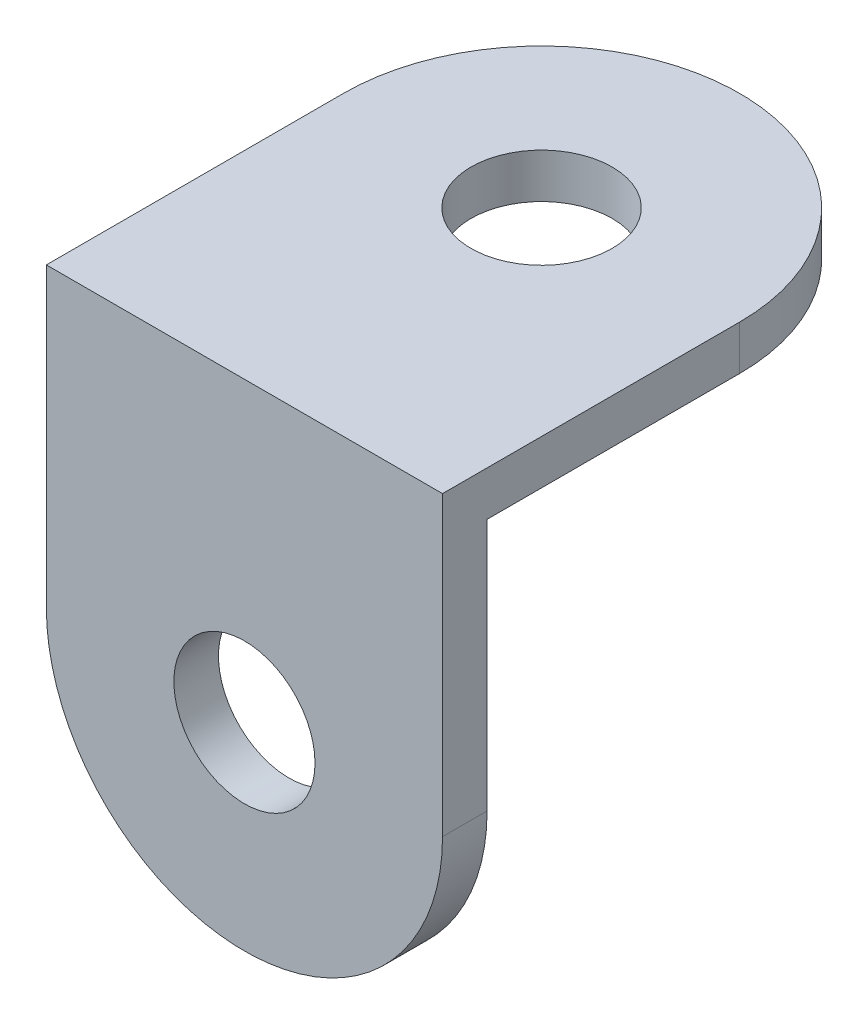
ISO-10303-21;
HEADER;
FILE_DESCRIPTION(('STEP AP214'),'2;1');
FILE_NAME('part.step','',(''),(''),'','','');
FILE_SCHEMA(('AUTOMOTIVE_DESIGN { 1 0 10303 214 1 1 1 1 }'));
ENDSEC;
DATA;
#1=APPLICATION_CONTEXT('core data for automotive mechanical design processes');
#2=APPLICATION_PROTOCOL_DEFINITION('international standard','automotive_design',2000,#1);
#3=PRODUCT_CONTEXT('',#1,'mechanical');
#4=PRODUCT('Part','Part','',(#3));
#5=PRODUCT_RELATED_PRODUCT_CATEGORY('part','',(#4));
#6=PRODUCT_DEFINITION_FORMATION('','',#4);
#7=PRODUCT_DEFINITION_CONTEXT('part definition',#1,'design');
#8=PRODUCT_DEFINITION('design','',#6,#7);
#9=PRODUCT_DEFINITION_SHAPE('','',#8);
#10=(LENGTH_UNIT() NAMED_UNIT(*) SI_UNIT(.MILLI.,.METRE.));
#11=(NAMED_UNIT(*) PLANE_ANGLE_UNIT() SI_UNIT($,.RADIAN.));
#12=(NAMED_UNIT(*) SI_UNIT($,.STERADIAN.) SOLID_ANGLE_UNIT());
#13=UNCERTAINTY_MEASURE_WITH_UNIT(LENGTH_MEASURE(1.E-05),#10,'distance_accuracy_value','');
#14=(GEOMETRIC_REPRESENTATION_CONTEXT(3) GLOBAL_UNCERTAINTY_ASSIGNED_CONTEXT((#13)) GLOBAL_UNIT_ASSIGNED_CONTEXT((#10,
#11,#12)) REPRESENTATION_CONTEXT('',''));
#15=CARTESIAN_POINT('',(0.,0.,0.));
#16=DIRECTION('',(0.,0.,1.));
#17=DIRECTION('',(1.,0.,0.));
#18=AXIS2_PLACEMENT_3D('',#15,#16,#17);
#19=CARTESIAN_POINT('',(0.,1.8,0.));
#20=DIRECTION('',(0.,1.,0.));
#21=DIRECTION('',(1.,0.,0.));
#22=AXIS2_PLACEMENT_3D('',#19,#20,#21);
#23=PLANE('',#22);
#24=CARTESIAN_POINT('',(0.,1.8,-12.));
#25=DIRECTION('',(0.,1.,0.));
#26=DIRECTION('',(1.,0.,0.));
#27=AXIS2_PLACEMENT_3D('',#24,#25,#26);
#28=CIRCLE('',#27,8.);
#29=CARTESIAN_POINT('',(8.,1.8,-12.));
#30=VERTEX_POINT('',#29);
#31=CARTESIAN_POINT('',(-8.,1.8,-12.));
#32=VERTEX_POINT('',#31);
#33=EDGE_CURVE('E11',#30,#32,#28,.T.);
#34=ORIENTED_EDGE('',*,*,#33,.T.);
#35=DIRECTION('',(0.,0.,1.));
#36=VECTOR('',#35,1.);
#37=CARTESIAN_POINT('',(-8.,1.8,-12.));
#38=LINE('',#37,#36);
#39=CARTESIAN_POINT('',(-8.,1.8,0.));
#40=VERTEX_POINT('',#39);
#41=EDGE_CURVE('E57',#32,#40,#38,.T.);
#42=ORIENTED_EDGE('',*,*,#41,.T.);
#43=DIRECTION('',(1.,0.,0.));
#44=VECTOR('',#43,1.);
#45=CARTESIAN_POINT('',(-8.,1.8,0.));
#46=LINE('',#45,#44);
#47=CARTESIAN_POINT('',(8.,1.8,0.));
#48=VERTEX_POINT('',#47);
#49=EDGE_CURVE('E106',#40,#48,#46,.T.);
#50=ORIENTED_EDGE('',*,*,#49,.T.);
#51=DIRECTION('',(0.,0.,-1.));
#52=VECTOR('',#51,1.);
#53=CARTESIAN_POINT('',(8.,1.8,0.));
#54=LINE('',#53,#52);
#55=EDGE_CURVE('E50',#48,#30,#54,.T.);
#56=ORIENTED_EDGE('',*,*,#55,.T.);
#57=EDGE_LOOP('',(#34,#42,#50,#56));
#58=FACE_BOUND('',#57,.T.);
#59=CARTESIAN_POINT('',(0.,1.8,-12.));
#60=DIRECTION('',(0.,-1.,0.));
#61=DIRECTION('',(0.,0.,-1.));
#62=AXIS2_PLACEMENT_3D('',#59,#60,#61);
#63=CIRCLE('',#62,2.84999999999999);
#64=CARTESIAN_POINT('',(0.,1.8,-14.85));
#65=VERTEX_POINT('',#64);
#66=EDGE_CURVE('E120',#65,#65,#63,.T.);
#67=ORIENTED_EDGE('',*,*,#66,.T.);
#68=EDGE_LOOP('',(#67));
#69=FACE_BOUND('',#68,.T.);
#70=ADVANCED_FACE('F46',(#58,#69),#23,.T.);
#71=CARTESIAN_POINT('',(0.,0.,0.));
#72=DIRECTION('',(0.,1.,0.));
#73=DIRECTION('',(1.,0.,0.));
#74=AXIS2_PLACEMENT_3D('',#71,#72,#73);
#75=PLANE('',#74);
#76=CARTESIAN_POINT('',(0.,0.,-12.));
#77=DIRECTION('',(0.,-1.,0.));
#78=DIRECTION('',(0.,0.,-1.));
#79=AXIS2_PLACEMENT_3D('',#76,#77,#78);
#80=CIRCLE('',#79,2.84999999999999);
#81=CARTESIAN_POINT('',(0.,0.,-14.85));
#82=VERTEX_POINT('',#81);
#83=EDGE_CURVE('E168',#82,#82,#80,.T.);
#84=ORIENTED_EDGE('',*,*,#83,.F.);
#85=EDGE_LOOP('',(#84));
#86=FACE_BOUND('',#85,.T.);
#87=DIRECTION('',(0.,0.,1.));
#88=VECTOR('',#87,1.);
#89=CARTESIAN_POINT('',(-8.,0.,-12.));
#90=LINE('',#89,#88);
#91=CARTESIAN_POINT('',(-8.,0.,-12.));
#92=VERTEX_POINT('',#91);
#93=CARTESIAN_POINT('',(-8.,0.,-1.8));
#94=VERTEX_POINT('',#93);
#95=EDGE_CURVE('E118',#92,#94,#90,.T.);
#96=ORIENTED_EDGE('',*,*,#95,.F.);
#97=CARTESIAN_POINT('',(0.,0.,-12.));
#98=DIRECTION('',(0.,1.,0.));
#99=DIRECTION('',(1.,0.,0.));
#100=AXIS2_PLACEMENT_3D('',#97,#98,#99);
#101=CIRCLE('',#100,8.);
#102=CARTESIAN_POINT('',(8.,0.,-12.));
#103=VERTEX_POINT('',#102);
#104=EDGE_CURVE('E65',#103,#92,#101,.T.);
#105=ORIENTED_EDGE('',*,*,#104,.F.);
#106=DIRECTION('',(0.,0.,-1.));
#107=VECTOR('',#106,1.);
#108=CARTESIAN_POINT('',(8.,0.,-1.8));
#109=LINE('',#108,#107);
#110=CARTESIAN_POINT('',(8.,0.,-1.8));
#111=VERTEX_POINT('',#110);
#112=EDGE_CURVE('E123',#111,#103,#109,.T.);
#113=ORIENTED_EDGE('',*,*,#112,.F.);
#114=DIRECTION('',(1.,0.,0.));
#115=VECTOR('',#114,1.);
#116=CARTESIAN_POINT('',(-8.,0.,-1.8));
#117=LINE('',#116,#115);
#118=EDGE_CURVE('E160',#94,#111,#117,.T.);
#119=ORIENTED_EDGE('',*,*,#118,.F.);
#120=EDGE_LOOP('',(#96,#105,#113,#119));
#121=FACE_BOUND('',#120,.T.);
#122=ADVANCED_FACE('F194',(#86,#121),#75,.F.);
#123=CARTESIAN_POINT('',(8.,0.,0.));
#124=DIRECTION('',(1.,0.,0.));
#125=DIRECTION('',(0.,1.,0.));
#126=AXIS2_PLACEMENT_3D('',#123,#124,#125);
#127=PLANE('',#126);
#128=DIRECTION('',(0.,1.,0.));
#129=VECTOR('',#128,1.);
#130=CARTESIAN_POINT('',(8.,0.,-12.));
#131=LINE('',#130,#129);
#132=EDGE_CURVE('E144',#103,#30,#131,.T.);
#133=ORIENTED_EDGE('',*,*,#132,.T.);
#134=ORIENTED_EDGE('',*,*,#55,.F.);
#135=DIRECTION('',(0.,1.,0.));
#136=VECTOR('',#135,1.);
#137=CARTESIAN_POINT('',(8.,-10.2,0.));
#138=LINE('',#137,#136);
#139=CARTESIAN_POINT('',(8.,-10.2,0.));
#140=VERTEX_POINT('',#139);
#141=EDGE_CURVE('E128',#140,#48,#138,.T.);
#142=ORIENTED_EDGE('',*,*,#141,.F.);
#143=DIRECTION('',(0.,0.,-1.));
#144=VECTOR('',#143,1.);
#145=CARTESIAN_POINT('',(8.,-10.2,0.));
#146=LINE('',#145,#144);
#147=CARTESIAN_POINT('',(8.,-10.2,-1.8));
#148=VERTEX_POINT('',#147);
#149=EDGE_CURVE('E147',#140,#148,#146,.T.);
#150=ORIENTED_EDGE('',*,*,#149,.T.);
#151=DIRECTION('',(0.,1.,0.));
#152=VECTOR('',#151,1.);
#153=CARTESIAN_POINT('',(8.,-10.2,-1.8));
#154=LINE('',#153,#152);
#155=EDGE_CURVE('E150',#148,#111,#154,.T.);
#156=ORIENTED_EDGE('',*,*,#155,.T.);
#157=ORIENTED_EDGE('',*,*,#112,.T.);
#158=EDGE_LOOP('',(#133,#134,#142,#150,#156,#157));
#159=FACE_BOUND('',#158,.T.);
#160=ADVANCED_FACE('F188',(#159),#127,.T.);
#161=CARTESIAN_POINT('',(0.,0.,-1.8));
#162=DIRECTION('',(0.,0.,1.));
#163=DIRECTION('',(1.,0.,0.));
#164=AXIS2_PLACEMENT_3D('',#161,#162,#163);
#165=PLANE('',#164);
#166=CARTESIAN_POINT('',(0.,-10.2,-1.8));
#167=DIRECTION('',(0.,0.,1.));
#168=DIRECTION('',(1.,0.,0.));
#169=AXIS2_PLACEMENT_3D('',#166,#167,#168);
#170=CIRCLE('',#169,2.84999999999999);
#171=CARTESIAN_POINT('',(2.84999999999999,-10.2,-1.8));
#172=VERTEX_POINT('',#171);
#173=EDGE_CURVE('E171',#172,#172,#170,.T.);
#174=ORIENTED_EDGE('',*,*,#173,.T.);
#175=EDGE_LOOP('',(#174));
#176=FACE_BOUND('',#175,.T.);
#177=ORIENTED_EDGE('',*,*,#155,.F.);
#178=CARTESIAN_POINT('',(0.,-10.2,-1.8));
#179=DIRECTION('',(0.,0.,1.));
#180=DIRECTION('',(-1.,0.,0.));
#181=AXIS2_PLACEMENT_3D('',#178,#179,#180);
#182=CIRCLE('',#181,8.);
#183=CARTESIAN_POINT('',(-8.,-10.2,-1.8));
#184=VERTEX_POINT('',#183);
#185=EDGE_CURVE('E129',#184,#148,#182,.T.);
#186=ORIENTED_EDGE('',*,*,#185,.F.);
#187=DIRECTION('',(0.,-1.,0.));
#188=VECTOR('',#187,1.);
#189=CARTESIAN_POINT('',(-8.,0.,-1.8));
#190=LINE('',#189,#188);
#191=EDGE_CURVE('E113',#94,#184,#190,.T.);
#192=ORIENTED_EDGE('',*,*,#191,.F.);
#193=ORIENTED_EDGE('',*,*,#118,.T.);
#194=EDGE_LOOP('',(#177,#186,#192,#193));
#195=FACE_BOUND('',#194,.T.);
#196=ADVANCED_FACE('F185',(#176,#195),#165,.F.);
#197=CARTESIAN_POINT('',(-8.,0.,0.));
#198=DIRECTION('',(0.,0.,1.));
#199=DIRECTION('',(1.,0.,0.));
#200=AXIS2_PLACEMENT_3D('',#197,#198,#199);
#201=PLANE('',#200);
#202=CARTESIAN_POINT('',(0.,-10.2,0.));
#203=DIRECTION('',(0.,0.,1.));
#204=DIRECTION('',(1.,0.,0.));
#205=AXIS2_PLACEMENT_3D('',#202,#203,#204);
#206=CIRCLE('',#205,2.84999999999999);
#207=CARTESIAN_POINT('',(2.84999999999999,-10.2,0.));
#208=VERTEX_POINT('',#207);
#209=EDGE_CURVE('E174',#208,#208,#206,.T.);
#210=ORIENTED_EDGE('',*,*,#209,.F.);
#211=EDGE_LOOP('',(#210));
#212=FACE_BOUND('',#211,.T.);
#213=ORIENTED_EDGE('',*,*,#49,.F.);
#214=DIRECTION('',(0.,-1.,0.));
#215=VECTOR('',#214,1.);
#216=CARTESIAN_POINT('',(-8.,1.8,0.));
#217=LINE('',#216,#215);
#218=CARTESIAN_POINT('',(-8.,-10.2,0.));
#219=VERTEX_POINT('',#218);
#220=EDGE_CURVE('E102',#40,#219,#217,.T.);
#221=ORIENTED_EDGE('',*,*,#220,.T.);
#222=CARTESIAN_POINT('',(0.,-10.2,0.));
#223=DIRECTION('',(0.,0.,1.));
#224=DIRECTION('',(-1.,0.,0.));
#225=AXIS2_PLACEMENT_3D('',#222,#223,#224);
#226=CIRCLE('',#225,8.);
#227=EDGE_CURVE('E136',#219,#140,#226,.T.);
#228=ORIENTED_EDGE('',*,*,#227,.T.);
#229=ORIENTED_EDGE('',*,*,#141,.T.);
#230=EDGE_LOOP('',(#213,#221,#228,#229));
#231=FACE_BOUND('',#230,.T.);
#232=ADVANCED_FACE('F181',(#212,#231),#201,.T.);
#233=CARTESIAN_POINT('',(0.,-10.2,0.));
#234=DIRECTION('',(0.,0.,1.));
#235=DIRECTION('',(0.,-1.,0.));
#236=AXIS2_PLACEMENT_3D('',#233,#234,#235);
#237=CYLINDRICAL_SURFACE('',#236,8.);
#238=DIRECTION('',(0.,0.,-1.));
#239=VECTOR('',#238,1.);
#240=CARTESIAN_POINT('',(-8.,-10.2,0.));
#241=LINE('',#240,#239);
#242=EDGE_CURVE('E125',#219,#184,#241,.T.);
#243=ORIENTED_EDGE('',*,*,#242,.T.);
#244=ORIENTED_EDGE('',*,*,#185,.T.);
#245=ORIENTED_EDGE('',*,*,#149,.F.);
#246=ORIENTED_EDGE('',*,*,#227,.F.);
#247=EDGE_LOOP('',(#243,#244,#245,#246));
#248=FACE_BOUND('',#247,.T.);
#249=ADVANCED_FACE('F184',(#248),#237,.T.);
#250=CARTESIAN_POINT('',(-8.,0.,-12.));
#251=DIRECTION('',(-1.,0.,0.));
#252=DIRECTION('',(0.,0.,1.));
#253=AXIS2_PLACEMENT_3D('',#250,#251,#252);
#254=PLANE('',#253);
#255=ORIENTED_EDGE('',*,*,#41,.F.);
#256=DIRECTION('',(0.,1.,0.));
#257=VECTOR('',#256,1.);
#258=CARTESIAN_POINT('',(-8.,0.,-12.));
#259=LINE('',#258,#257);
#260=EDGE_CURVE('E99',#92,#32,#259,.T.);
#261=ORIENTED_EDGE('',*,*,#260,.F.);
#262=ORIENTED_EDGE('',*,*,#95,.T.);
#263=ORIENTED_EDGE('',*,*,#191,.T.);
#264=ORIENTED_EDGE('',*,*,#242,.F.);
#265=ORIENTED_EDGE('',*,*,#220,.F.);
#266=EDGE_LOOP('',(#255,#261,#262,#263,#264,#265));
#267=FACE_BOUND('',#266,.T.);
#268=ADVANCED_FACE('F48',(#267),#254,.T.);
#269=CARTESIAN_POINT('',(0.,0.,-12.));
#270=DIRECTION('',(0.,1.,0.));
#271=DIRECTION('',(1.,0.,0.));
#272=AXIS2_PLACEMENT_3D('',#269,#270,#271);
#273=CYLINDRICAL_SURFACE('',#272,8.);
#274=ORIENTED_EDGE('',*,*,#260,.T.);
#275=ORIENTED_EDGE('',*,*,#33,.F.);
#276=ORIENTED_EDGE('',*,*,#132,.F.);
#277=ORIENTED_EDGE('',*,*,#104,.T.);
#278=EDGE_LOOP('',(#274,#275,#276,#277));
#279=FACE_BOUND('',#278,.T.);
#280=ADVANCED_FACE('F111',(#279),#273,.T.);
#281=CARTESIAN_POINT('',(0.,0.,-12.));
#282=DIRECTION('',(0.,-1.,0.));
#283=DIRECTION('',(0.,0.,-1.));
#284=AXIS2_PLACEMENT_3D('',#281,#282,#283);
#285=CYLINDRICAL_SURFACE('',#284,2.84999999999999);
#286=ORIENTED_EDGE('',*,*,#66,.F.);
#287=EDGE_LOOP('',(#286));
#288=FACE_BOUND('',#287,.T.);
#289=ORIENTED_EDGE('',*,*,#83,.T.);
#290=EDGE_LOOP('',(#289));
#291=FACE_BOUND('',#290,.T.);
#292=ADVANCED_FACE('F235',(#288,#291),#285,.F.);
#293=CARTESIAN_POINT('',(0.,-10.2,0.));
#294=DIRECTION('',(0.,0.,1.));
#295=DIRECTION('',(1.,0.,0.));
#296=AXIS2_PLACEMENT_3D('',#293,#294,#295);
#297=CYLINDRICAL_SURFACE('',#296,2.84999999999999);
#298=ORIENTED_EDGE('',*,*,#209,.T.);
#299=EDGE_LOOP('',(#298));
#300=FACE_BOUND('',#299,.T.);
#301=ORIENTED_EDGE('',*,*,#173,.F.);
#302=EDGE_LOOP('',(#301));
#303=FACE_BOUND('',#302,.T.);
#304=ADVANCED_FACE('F178',(#300,#303),#297,.F.);
#305=CLOSED_SHELL('',(#70,#122,#160,#196,#232,#249,#268,#280,#292,#304));
#306=MANIFOLD_SOLID_BREP('B2',#305);
#307=ADVANCED_BREP_SHAPE_REPRESENTATION('',(#18,#306),#14);
#308=SHAPE_DEFINITION_REPRESENTATION(#9,#307);
ENDSEC;
END-ISO-10303-21;
